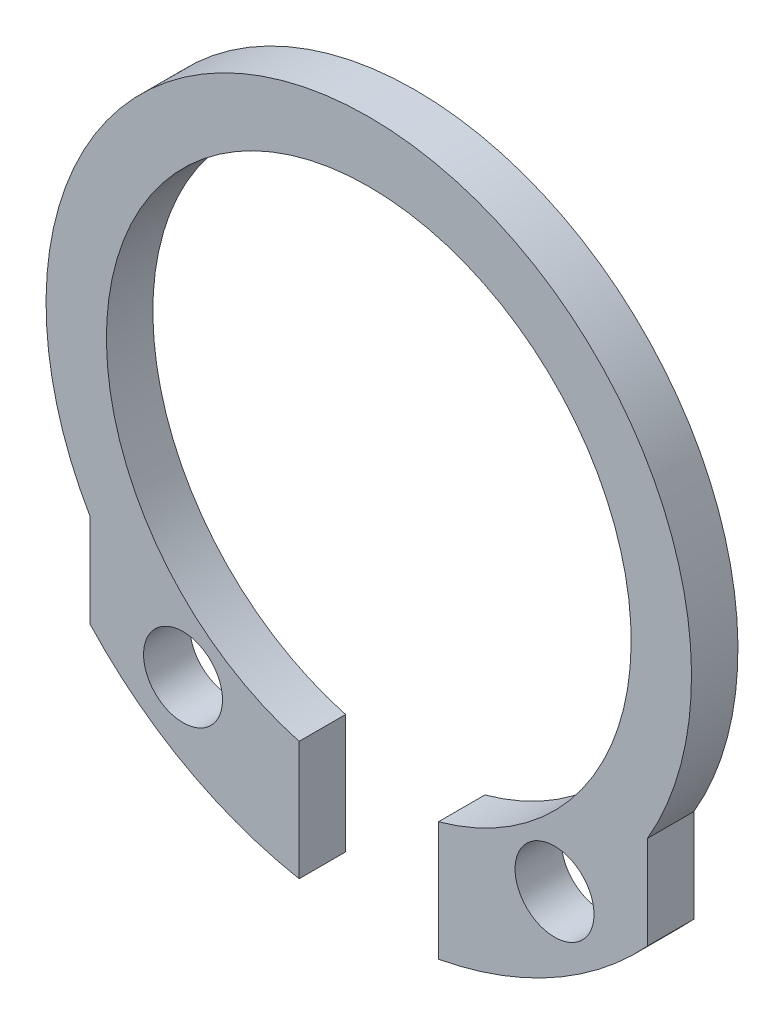
ISO-10303-21;
HEADER;
FILE_DESCRIPTION(('STEP AP214'),'2;1');
FILE_NAME('part.step','',(''),(''),'','','');
FILE_SCHEMA(('AUTOMOTIVE_DESIGN { 1 0 10303 214 1 1 1 1 }'));
ENDSEC;
DATA;
#1=APPLICATION_CONTEXT('core data for automotive mechanical design processes');
#2=APPLICATION_PROTOCOL_DEFINITION('international standard','automotive_design',2000,#1);
#3=PRODUCT_CONTEXT('',#1,'mechanical');
#4=PRODUCT('Part','Part','',(#3));
#5=PRODUCT_RELATED_PRODUCT_CATEGORY('part','',(#4));
#6=PRODUCT_DEFINITION_FORMATION('','',#4);
#7=PRODUCT_DEFINITION_CONTEXT('part definition',#1,'design');
#8=PRODUCT_DEFINITION('design','',#6,#7);
#9=PRODUCT_DEFINITION_SHAPE('','',#8);
#10=(LENGTH_UNIT() NAMED_UNIT(*) SI_UNIT(.MILLI.,.METRE.));
#11=(NAMED_UNIT(*) PLANE_ANGLE_UNIT() SI_UNIT($,.RADIAN.));
#12=(NAMED_UNIT(*) SI_UNIT($,.STERADIAN.) SOLID_ANGLE_UNIT());
#13=UNCERTAINTY_MEASURE_WITH_UNIT(LENGTH_MEASURE(1.E-05),#10,'distance_accuracy_value','');
#14=(GEOMETRIC_REPRESENTATION_CONTEXT(3) GLOBAL_UNCERTAINTY_ASSIGNED_CONTEXT((#13)) GLOBAL_UNIT_ASSIGNED_CONTEXT((#10,
#11,#12)) REPRESENTATION_CONTEXT('',''));
#15=CARTESIAN_POINT('',(0.,0.,0.));
#16=DIRECTION('',(0.,0.,1.));
#17=DIRECTION('',(1.,0.,0.));
#18=AXIS2_PLACEMENT_3D('',#15,#16,#17);
#19=CARTESIAN_POINT('',(6.,0.,1.));
#20=DIRECTION('',(1.,0.,0.));
#21=DIRECTION('',(0.,0.,-1.));
#22=AXIS2_PLACEMENT_3D('',#19,#20,#21);
#23=PLANE('',#22);
#24=DIRECTION('',(0.,-1.,0.));
#25=VECTOR('',#24,1.);
#26=CARTESIAN_POINT('',(6.,0.,0.));
#27=LINE('',#26,#25);
#28=CARTESIAN_POINT('',(6.,-3.50749198145911,0.));
#29=VERTEX_POINT('',#28);
#30=CARTESIAN_POINT('',(6.,-5.51565952538769,0.));
#31=VERTEX_POINT('',#30);
#32=EDGE_CURVE('E139',#29,#31,#27,.T.);
#33=ORIENTED_EDGE('',*,*,#32,.F.);
#34=DIRECTION('',(0.,0.,-1.));
#35=VECTOR('',#34,1.);
#36=CARTESIAN_POINT('',(6.,-3.50749198145911,1.));
#37=LINE('',#36,#35);
#38=CARTESIAN_POINT('',(6.,-3.50749198145911,1.));
#39=VERTEX_POINT('',#38);
#40=EDGE_CURVE('E11',#39,#29,#37,.T.);
#41=ORIENTED_EDGE('',*,*,#40,.F.);
#42=DIRECTION('',(0.,-1.,0.));
#43=VECTOR('',#42,1.);
#44=CARTESIAN_POINT('',(6.,0.,1.));
#45=LINE('',#44,#43);
#46=CARTESIAN_POINT('',(6.,-5.51565952538769,1.));
#47=VERTEX_POINT('',#46);
#48=EDGE_CURVE('E292',#39,#47,#45,.T.);
#49=ORIENTED_EDGE('',*,*,#48,.T.);
#50=DIRECTION('',(0.,0.,-1.));
#51=VECTOR('',#50,1.);
#52=CARTESIAN_POINT('',(6.,-5.51565952538769,1.));
#53=LINE('',#52,#51);
#54=EDGE_CURVE('E87',#47,#31,#53,.T.);
#55=ORIENTED_EDGE('',*,*,#54,.T.);
#56=EDGE_LOOP('',(#33,#41,#49,#55));
#57=FACE_BOUND('',#56,.T.);
#58=ADVANCED_FACE('F35',(#57),#23,.T.);
#59=CARTESIAN_POINT('',(0.,0.,1.));
#60=DIRECTION('',(0.,0.,-1.));
#61=DIRECTION('',(-1.,0.,0.));
#62=AXIS2_PLACEMENT_3D('',#59,#60,#61);
#63=CYLINDRICAL_SURFACE('',#62,6.95);
#64=CARTESIAN_POINT('',(0.,0.,0.));
#65=DIRECTION('',(0.,0.,1.));
#66=DIRECTION('',(1.,0.,0.));
#67=AXIS2_PLACEMENT_3D('',#64,#65,#66);
#68=CIRCLE('',#67,6.95);
#69=CARTESIAN_POINT('',(-6.,-3.50749198145911,0.));
#70=VERTEX_POINT('',#69);
#71=EDGE_CURVE('E141',#29,#70,#68,.T.);
#72=ORIENTED_EDGE('',*,*,#71,.T.);
#73=DIRECTION('',(0.,0.,-1.));
#74=VECTOR('',#73,1.);
#75=CARTESIAN_POINT('',(-6.,-3.50749198145911,1.));
#76=LINE('',#75,#74);
#77=CARTESIAN_POINT('',(-6.,-3.50749198145911,1.));
#78=VERTEX_POINT('',#77);
#79=EDGE_CURVE('E44',#78,#70,#76,.T.);
#80=ORIENTED_EDGE('',*,*,#79,.F.);
#81=CARTESIAN_POINT('',(0.,0.,1.));
#82=DIRECTION('',(0.,0.,1.));
#83=DIRECTION('',(1.,0.,0.));
#84=AXIS2_PLACEMENT_3D('',#81,#82,#83);
#85=CIRCLE('',#84,6.95);
#86=EDGE_CURVE('E290',#39,#78,#85,.T.);
#87=ORIENTED_EDGE('',*,*,#86,.F.);
#88=ORIENTED_EDGE('',*,*,#40,.T.);
#89=EDGE_LOOP('',(#72,#80,#87,#88));
#90=FACE_BOUND('',#89,.T.);
#91=ADVANCED_FACE('F175',(#90),#63,.T.);
#92=CARTESIAN_POINT('',(-6.,0.,1.));
#93=DIRECTION('',(1.,0.,0.));
#94=DIRECTION('',(0.,0.,-1.));
#95=AXIS2_PLACEMENT_3D('',#92,#93,#94);
#96=PLANE('',#95);
#97=DIRECTION('',(0.,-1.,0.));
#98=VECTOR('',#97,1.);
#99=CARTESIAN_POINT('',(-6.,0.,0.));
#100=LINE('',#99,#98);
#101=CARTESIAN_POINT('',(-6.,-5.5156595253877,0.));
#102=VERTEX_POINT('',#101);
#103=EDGE_CURVE('E144',#70,#102,#100,.T.);
#104=ORIENTED_EDGE('',*,*,#103,.T.);
#105=DIRECTION('',(0.,0.,-1.));
#106=VECTOR('',#105,1.);
#107=CARTESIAN_POINT('',(-6.,-5.5156595253877,1.));
#108=LINE('',#107,#106);
#109=CARTESIAN_POINT('',(-6.,-5.5156595253877,1.));
#110=VERTEX_POINT('',#109);
#111=EDGE_CURVE('E163',#110,#102,#108,.T.);
#112=ORIENTED_EDGE('',*,*,#111,.F.);
#113=DIRECTION('',(0.,-1.,0.));
#114=VECTOR('',#113,1.);
#115=CARTESIAN_POINT('',(-6.,0.,1.));
#116=LINE('',#115,#114);
#117=EDGE_CURVE('E171',#78,#110,#116,.T.);
#118=ORIENTED_EDGE('',*,*,#117,.F.);
#119=ORIENTED_EDGE('',*,*,#79,.T.);
#120=EDGE_LOOP('',(#104,#112,#118,#119));
#121=FACE_BOUND('',#120,.T.);
#122=ADVANCED_FACE('F168',(#121),#96,.F.);
#123=CARTESIAN_POINT('',(0.,0.,1.));
#124=DIRECTION('',(0.,0.,-1.));
#125=DIRECTION('',(-1.,0.,0.));
#126=AXIS2_PLACEMENT_3D('',#123,#124,#125);
#127=CYLINDRICAL_SURFACE('',#126,8.15);
#128=CARTESIAN_POINT('',(0.,0.,0.));
#129=DIRECTION('',(0.,0.,1.));
#130=DIRECTION('',(1.,0.,0.));
#131=AXIS2_PLACEMENT_3D('',#128,#129,#130);
#132=CIRCLE('',#131,8.15);
#133=CARTESIAN_POINT('',(-1.5,-8.0107739950644,0.));
#134=VERTEX_POINT('',#133);
#135=EDGE_CURVE('E147',#102,#134,#132,.T.);
#136=ORIENTED_EDGE('',*,*,#135,.T.);
#137=DIRECTION('',(0.,0.,-1.));
#138=VECTOR('',#137,1.);
#139=CARTESIAN_POINT('',(-1.5,-8.0107739950644,1.));
#140=LINE('',#139,#138);
#141=CARTESIAN_POINT('',(-1.5,-8.0107739950644,1.));
#142=VERTEX_POINT('',#141);
#143=EDGE_CURVE('E161',#142,#134,#140,.T.);
#144=ORIENTED_EDGE('',*,*,#143,.F.);
#145=CARTESIAN_POINT('',(0.,0.,1.));
#146=DIRECTION('',(0.,0.,1.));
#147=DIRECTION('',(1.,0.,0.));
#148=AXIS2_PLACEMENT_3D('',#145,#146,#147);
#149=CIRCLE('',#148,8.15);
#150=EDGE_CURVE('E128',#110,#142,#149,.T.);
#151=ORIENTED_EDGE('',*,*,#150,.F.);
#152=ORIENTED_EDGE('',*,*,#111,.T.);
#153=EDGE_LOOP('',(#136,#144,#151,#152));
#154=FACE_BOUND('',#153,.T.);
#155=ADVANCED_FACE('F217',(#154),#127,.T.);
#156=CARTESIAN_POINT('',(-1.5,0.,1.));
#157=DIRECTION('',(1.,0.,0.));
#158=DIRECTION('',(0.,1.,0.));
#159=AXIS2_PLACEMENT_3D('',#156,#157,#158);
#160=PLANE('',#159);
#161=DIRECTION('',(0.,-1.,0.));
#162=VECTOR('',#161,1.);
#163=CARTESIAN_POINT('',(-1.5,0.,0.));
#164=LINE('',#163,#162);
#165=CARTESIAN_POINT('',(-1.5,-5.4472470111057,0.));
#166=VERTEX_POINT('',#165);
#167=EDGE_CURVE('E150',#166,#134,#164,.T.);
#168=ORIENTED_EDGE('',*,*,#167,.F.);
#169=DIRECTION('',(0.,0.,-1.));
#170=VECTOR('',#169,1.);
#171=CARTESIAN_POINT('',(-1.5,-5.4472470111057,1.));
#172=LINE('',#171,#170);
#173=CARTESIAN_POINT('',(-1.5,-5.4472470111057,1.));
#174=VERTEX_POINT('',#173);
#175=EDGE_CURVE('E116',#174,#166,#172,.T.);
#176=ORIENTED_EDGE('',*,*,#175,.F.);
#177=DIRECTION('',(0.,-1.,0.));
#178=VECTOR('',#177,1.);
#179=CARTESIAN_POINT('',(-1.5,0.,1.));
#180=LINE('',#179,#178);
#181=EDGE_CURVE('E126',#174,#142,#180,.T.);
#182=ORIENTED_EDGE('',*,*,#181,.T.);
#183=ORIENTED_EDGE('',*,*,#143,.T.);
#184=EDGE_LOOP('',(#168,#176,#182,#183));
#185=FACE_BOUND('',#184,.T.);
#186=ADVANCED_FACE('F214',(#185),#160,.T.);
#187=CARTESIAN_POINT('',(0.,0.,1.));
#188=DIRECTION('',(0.,0.,-1.));
#189=DIRECTION('',(-1.,0.,0.));
#190=AXIS2_PLACEMENT_3D('',#187,#188,#189);
#191=CYLINDRICAL_SURFACE('',#190,5.65);
#192=CARTESIAN_POINT('',(0.,0.,0.));
#193=DIRECTION('',(0.,0.,1.));
#194=DIRECTION('',(1.,0.,0.));
#195=AXIS2_PLACEMENT_3D('',#192,#193,#194);
#196=CIRCLE('',#195,5.65);
#197=CARTESIAN_POINT('',(1.5,-5.4472470111057,0.));
#198=VERTEX_POINT('',#197);
#199=EDGE_CURVE('E113',#198,#166,#196,.T.);
#200=ORIENTED_EDGE('',*,*,#199,.F.);
#201=DIRECTION('',(0.,0.,-1.));
#202=VECTOR('',#201,1.);
#203=CARTESIAN_POINT('',(1.5,-5.4472470111057,1.));
#204=LINE('',#203,#202);
#205=CARTESIAN_POINT('',(1.5,-5.4472470111057,1.));
#206=VERTEX_POINT('',#205);
#207=EDGE_CURVE('E107',#206,#198,#204,.T.);
#208=ORIENTED_EDGE('',*,*,#207,.F.);
#209=CARTESIAN_POINT('',(0.,0.,1.));
#210=DIRECTION('',(0.,0.,1.));
#211=DIRECTION('',(1.,0.,0.));
#212=AXIS2_PLACEMENT_3D('',#209,#210,#211);
#213=CIRCLE('',#212,5.65);
#214=EDGE_CURVE('E111',#206,#174,#213,.T.);
#215=ORIENTED_EDGE('',*,*,#214,.T.);
#216=ORIENTED_EDGE('',*,*,#175,.T.);
#217=EDGE_LOOP('',(#200,#208,#215,#216));
#218=FACE_BOUND('',#217,.T.);
#219=ADVANCED_FACE('F109',(#218),#191,.F.);
#220=CARTESIAN_POINT('',(1.5,0.,1.));
#221=DIRECTION('',(1.,0.,0.));
#222=DIRECTION('',(0.,1.,0.));
#223=AXIS2_PLACEMENT_3D('',#220,#221,#222);
#224=PLANE('',#223);
#225=DIRECTION('',(0.,-1.,0.));
#226=VECTOR('',#225,1.);
#227=CARTESIAN_POINT('',(1.5,0.,0.));
#228=LINE('',#227,#226);
#229=CARTESIAN_POINT('',(1.5,-8.0107739950644,0.));
#230=VERTEX_POINT('',#229);
#231=EDGE_CURVE('E154',#198,#230,#228,.T.);
#232=ORIENTED_EDGE('',*,*,#231,.T.);
#233=DIRECTION('',(0.,0.,-1.));
#234=VECTOR('',#233,1.);
#235=CARTESIAN_POINT('',(1.5,-8.0107739950644,1.));
#236=LINE('',#235,#234);
#237=CARTESIAN_POINT('',(1.5,-8.0107739950644,1.));
#238=VERTEX_POINT('',#237);
#239=EDGE_CURVE('E117',#238,#230,#236,.T.);
#240=ORIENTED_EDGE('',*,*,#239,.F.);
#241=DIRECTION('',(0.,-1.,0.));
#242=VECTOR('',#241,1.);
#243=CARTESIAN_POINT('',(1.5,0.,1.));
#244=LINE('',#243,#242);
#245=EDGE_CURVE('E120',#206,#238,#244,.T.);
#246=ORIENTED_EDGE('',*,*,#245,.F.);
#247=ORIENTED_EDGE('',*,*,#207,.T.);
#248=EDGE_LOOP('',(#232,#240,#246,#247));
#249=FACE_BOUND('',#248,.T.);
#250=ADVANCED_FACE('F121',(#249),#224,.F.);
#251=CARTESIAN_POINT('',(-4.,-5.5,1.));
#252=DIRECTION('',(0.,0.,-1.));
#253=DIRECTION('',(-1.,0.,0.));
#254=AXIS2_PLACEMENT_3D('',#251,#252,#253);
#255=CYLINDRICAL_SURFACE('',#254,0.85);
#256=CARTESIAN_POINT('',(-4.,-5.5,1.));
#257=DIRECTION('',(0.,0.,1.));
#258=DIRECTION('',(1.,0.,0.));
#259=AXIS2_PLACEMENT_3D('',#256,#257,#258);
#260=CIRCLE('',#259,0.85);
#261=CARTESIAN_POINT('',(-3.15,-5.5,1.));
#262=VERTEX_POINT('',#261);
#263=EDGE_CURVE('E197',#262,#262,#260,.T.);
#264=ORIENTED_EDGE('',*,*,#263,.T.);
#265=EDGE_LOOP('',(#264));
#266=FACE_BOUND('',#265,.T.);
#267=CARTESIAN_POINT('',(-4.,-5.5,0.));
#268=DIRECTION('',(0.,0.,1.));
#269=DIRECTION('',(1.,0.,0.));
#270=AXIS2_PLACEMENT_3D('',#267,#268,#269);
#271=CIRCLE('',#270,0.85);
#272=CARTESIAN_POINT('',(-3.15,-5.5,0.));
#273=VERTEX_POINT('',#272);
#274=EDGE_CURVE('E136',#273,#273,#271,.T.);
#275=ORIENTED_EDGE('',*,*,#274,.F.);
#276=EDGE_LOOP('',(#275));
#277=FACE_BOUND('',#276,.T.);
#278=ADVANCED_FACE('F184',(#266,#277),#255,.F.);
#279=CARTESIAN_POINT('',(4.,-5.5,1.));
#280=DIRECTION('',(0.,0.,-1.));
#281=DIRECTION('',(-1.,0.,0.));
#282=AXIS2_PLACEMENT_3D('',#279,#280,#281);
#283=CYLINDRICAL_SURFACE('',#282,0.85);
#284=CARTESIAN_POINT('',(4.,-5.5,1.));
#285=DIRECTION('',(0.,0.,1.));
#286=DIRECTION('',(1.,0.,0.));
#287=AXIS2_PLACEMENT_3D('',#284,#285,#286);
#288=CIRCLE('',#287,0.85);
#289=CARTESIAN_POINT('',(4.85,-5.5,1.));
#290=VERTEX_POINT('',#289);
#291=EDGE_CURVE('E157',#290,#290,#288,.T.);
#292=ORIENTED_EDGE('',*,*,#291,.T.);
#293=EDGE_LOOP('',(#292));
#294=FACE_BOUND('',#293,.T.);
#295=CARTESIAN_POINT('',(4.,-5.5,0.));
#296=DIRECTION('',(0.,0.,1.));
#297=DIRECTION('',(1.,0.,0.));
#298=AXIS2_PLACEMENT_3D('',#295,#296,#297);
#299=CIRCLE('',#298,0.85);
#300=CARTESIAN_POINT('',(4.85,-5.5,0.));
#301=VERTEX_POINT('',#300);
#302=EDGE_CURVE('E133',#301,#301,#299,.T.);
#303=ORIENTED_EDGE('',*,*,#302,.F.);
#304=EDGE_LOOP('',(#303));
#305=FACE_BOUND('',#304,.T.);
#306=ADVANCED_FACE('F37',(#294,#305),#283,.F.);
#307=CARTESIAN_POINT('',(0.,0.,1.));
#308=DIRECTION('',(0.,0.,-1.));
#309=DIRECTION('',(-1.,0.,0.));
#310=AXIS2_PLACEMENT_3D('',#307,#308,#309);
#311=CYLINDRICAL_SURFACE('',#310,8.15);
#312=CARTESIAN_POINT('',(0.,0.,0.));
#313=DIRECTION('',(0.,0.,1.));
#314=DIRECTION('',(1.,0.,0.));
#315=AXIS2_PLACEMENT_3D('',#312,#313,#314);
#316=CIRCLE('',#315,8.15);
#317=EDGE_CURVE('E80',#230,#31,#316,.T.);
#318=ORIENTED_EDGE('',*,*,#317,.T.);
#319=ORIENTED_EDGE('',*,*,#54,.F.);
#320=CARTESIAN_POINT('',(0.,0.,1.));
#321=DIRECTION('',(0.,0.,1.));
#322=DIRECTION('',(1.,0.,0.));
#323=AXIS2_PLACEMENT_3D('',#320,#321,#322);
#324=CIRCLE('',#323,8.15);
#325=EDGE_CURVE('E52',#238,#47,#324,.T.);
#326=ORIENTED_EDGE('',*,*,#325,.F.);
#327=ORIENTED_EDGE('',*,*,#239,.T.);
#328=EDGE_LOOP('',(#318,#319,#326,#327));
#329=FACE_BOUND('',#328,.T.);
#330=ADVANCED_FACE('F191',(#329),#311,.T.);
#331=CARTESIAN_POINT('',(0.,0.,1.));
#332=DIRECTION('',(0.,0.,1.));
#333=DIRECTION('',(1.,0.,0.));
#334=AXIS2_PLACEMENT_3D('',#331,#332,#333);
#335=PLANE('',#334);
#336=ORIENTED_EDGE('',*,*,#291,.F.);
#337=EDGE_LOOP('',(#336));
#338=FACE_BOUND('',#337,.T.);
#339=ORIENTED_EDGE('',*,*,#263,.F.);
#340=EDGE_LOOP('',(#339));
#341=FACE_BOUND('',#340,.T.);
#342=ORIENTED_EDGE('',*,*,#48,.F.);
#343=ORIENTED_EDGE('',*,*,#86,.T.);
#344=ORIENTED_EDGE('',*,*,#117,.T.);
#345=ORIENTED_EDGE('',*,*,#150,.T.);
#346=ORIENTED_EDGE('',*,*,#181,.F.);
#347=ORIENTED_EDGE('',*,*,#214,.F.);
#348=ORIENTED_EDGE('',*,*,#245,.T.);
#349=ORIENTED_EDGE('',*,*,#325,.T.);
#350=EDGE_LOOP('',(#342,#343,#344,#345,#346,#347,#348,#349));
#351=FACE_BOUND('',#350,.T.);
#352=ADVANCED_FACE('F124',(#338,#341,#351),#335,.T.);
#353=CARTESIAN_POINT('',(0.,0.,0.));
#354=DIRECTION('',(0.,0.,1.));
#355=DIRECTION('',(1.,0.,0.));
#356=AXIS2_PLACEMENT_3D('',#353,#354,#355);
#357=PLANE('',#356);
#358=ORIENTED_EDGE('',*,*,#302,.T.);
#359=EDGE_LOOP('',(#358));
#360=FACE_BOUND('',#359,.T.);
#361=ORIENTED_EDGE('',*,*,#274,.T.);
#362=EDGE_LOOP('',(#361));
#363=FACE_BOUND('',#362,.T.);
#364=ORIENTED_EDGE('',*,*,#32,.T.);
#365=ORIENTED_EDGE('',*,*,#317,.F.);
#366=ORIENTED_EDGE('',*,*,#231,.F.);
#367=ORIENTED_EDGE('',*,*,#199,.T.);
#368=ORIENTED_EDGE('',*,*,#167,.T.);
#369=ORIENTED_EDGE('',*,*,#135,.F.);
#370=ORIENTED_EDGE('',*,*,#103,.F.);
#371=ORIENTED_EDGE('',*,*,#71,.F.);
#372=EDGE_LOOP('',(#364,#365,#366,#367,#368,#369,#370,#371));
#373=FACE_BOUND('',#372,.T.);
#374=ADVANCED_FACE('F176',(#360,#363,#373),#357,.F.);
#375=CLOSED_SHELL('',(#58,#91,#122,#155,#186,#219,#250,#278,#306,#330,#352,#374));
#376=MANIFOLD_SOLID_BREP('B2',#375);
#377=ADVANCED_BREP_SHAPE_REPRESENTATION('',(#18,#376),#14);
#378=SHAPE_DEFINITION_REPRESENTATION(#9,#377);
ENDSEC;
END-ISO-10303-21;
